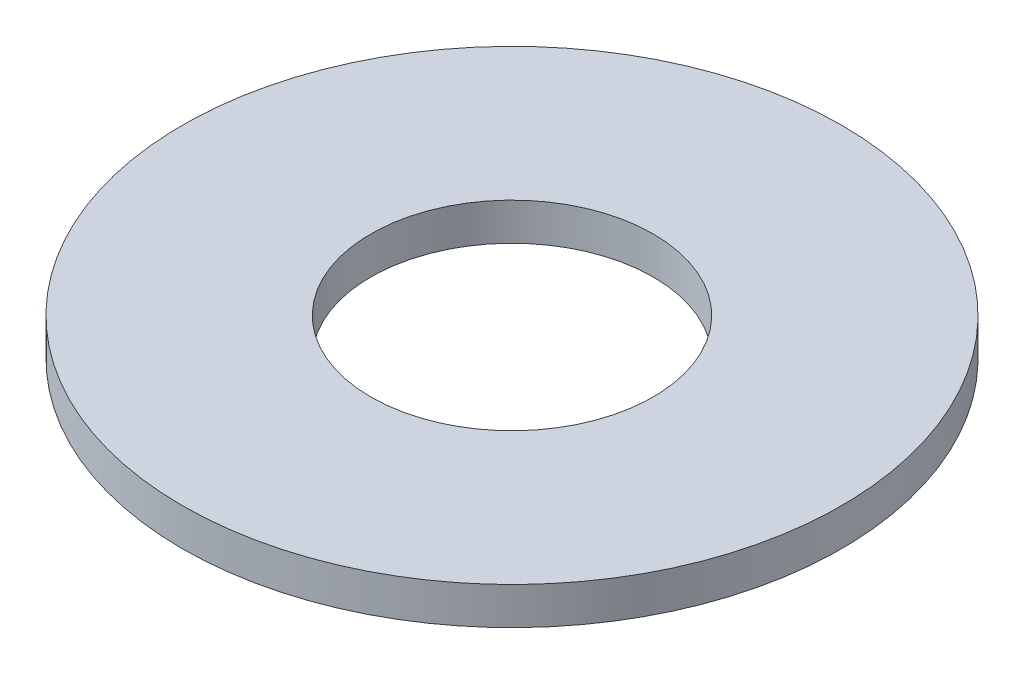
ISO-10303-21;
HEADER;
FILE_DESCRIPTION(('STEP AP214'),'2;1');
FILE_NAME('part.step','',(''),(''),'','','');
FILE_SCHEMA(('AUTOMOTIVE_DESIGN { 1 0 10303 214 1 1 1 1 }'));
ENDSEC;
DATA;
#1=APPLICATION_CONTEXT('core data for automotive mechanical design processes');
#2=APPLICATION_PROTOCOL_DEFINITION('international standard','automotive_design',2000,#1);
#3=PRODUCT_CONTEXT('',#1,'mechanical');
#4=PRODUCT('Part','Part','',(#3));
#5=PRODUCT_RELATED_PRODUCT_CATEGORY('part','',(#4));
#6=PRODUCT_DEFINITION_FORMATION('','',#4);
#7=PRODUCT_DEFINITION_CONTEXT('part definition',#1,'design');
#8=PRODUCT_DEFINITION('design','',#6,#7);
#9=PRODUCT_DEFINITION_SHAPE('','',#8);
#10=(LENGTH_UNIT() NAMED_UNIT(*) SI_UNIT(.MILLI.,.METRE.));
#11=(NAMED_UNIT(*) PLANE_ANGLE_UNIT() SI_UNIT($,.RADIAN.));
#12=(NAMED_UNIT(*) SI_UNIT($,.STERADIAN.) SOLID_ANGLE_UNIT());
#13=UNCERTAINTY_MEASURE_WITH_UNIT(LENGTH_MEASURE(1.E-05),#10,'distance_accuracy_value','');
#14=(GEOMETRIC_REPRESENTATION_CONTEXT(3) GLOBAL_UNCERTAINTY_ASSIGNED_CONTEXT((#13)) GLOBAL_UNIT_ASSIGNED_CONTEXT((#10,
#11,#12)) REPRESENTATION_CONTEXT('',''));
#15=CARTESIAN_POINT('',(0.,0.,0.));
#16=DIRECTION('',(0.,0.,1.));
#17=DIRECTION('',(1.,0.,0.));
#18=AXIS2_PLACEMENT_3D('',#15,#16,#17);
#19=CARTESIAN_POINT('',(0.,0.79375,0.));
#20=DIRECTION('',(0.,1.,0.));
#21=DIRECTION('',(0.,0.,1.));
#22=AXIS2_PLACEMENT_3D('',#19,#20,#21);
#23=PLANE('',#22);
#24=CARTESIAN_POINT('',(0.,0.79375,0.));
#25=DIRECTION('',(0.,1.,0.));
#26=DIRECTION('',(0.,0.,1.));
#27=AXIS2_PLACEMENT_3D('',#24,#25,#26);
#28=CIRCLE('',#27,7.);
#29=CARTESIAN_POINT('',(0.,0.79375,7.));
#30=VERTEX_POINT('',#29);
#31=EDGE_CURVE('E10',#30,#30,#28,.T.);
#32=ORIENTED_EDGE('',*,*,#31,.T.);
#33=EDGE_LOOP('',(#32));
#34=FACE_BOUND('',#33,.T.);
#35=CARTESIAN_POINT('',(0.,0.79375,0.));
#36=DIRECTION('',(0.,1.,0.));
#37=DIRECTION('',(0.,0.,1.));
#38=AXIS2_PLACEMENT_3D('',#35,#36,#37);
#39=CIRCLE('',#38,3.);
#40=CARTESIAN_POINT('',(0.,0.79375,3.));
#41=VERTEX_POINT('',#40);
#42=EDGE_CURVE('E46',#41,#41,#39,.T.);
#43=ORIENTED_EDGE('',*,*,#42,.F.);
#44=EDGE_LOOP('',(#43));
#45=FACE_BOUND('',#44,.T.);
#46=ADVANCED_FACE('F35',(#34,#45),#23,.T.);
#47=CARTESIAN_POINT('',(0.,0.,0.));
#48=DIRECTION('',(0.,1.,0.));
#49=DIRECTION('',(0.,0.,1.));
#50=AXIS2_PLACEMENT_3D('',#47,#48,#49);
#51=PLANE('',#50);
#52=CARTESIAN_POINT('',(0.,0.,0.));
#53=DIRECTION('',(0.,1.,0.));
#54=DIRECTION('',(0.,0.,1.));
#55=AXIS2_PLACEMENT_3D('',#52,#53,#54);
#56=CIRCLE('',#55,7.);
#57=CARTESIAN_POINT('',(0.,0.,7.));
#58=VERTEX_POINT('',#57);
#59=EDGE_CURVE('E39',#58,#58,#56,.T.);
#60=ORIENTED_EDGE('',*,*,#59,.F.);
#61=EDGE_LOOP('',(#60));
#62=FACE_BOUND('',#61,.T.);
#63=CARTESIAN_POINT('',(0.,0.,0.));
#64=DIRECTION('',(0.,1.,0.));
#65=DIRECTION('',(0.,0.,1.));
#66=AXIS2_PLACEMENT_3D('',#63,#64,#65);
#67=CIRCLE('',#66,3.);
#68=CARTESIAN_POINT('',(0.,0.,3.));
#69=VERTEX_POINT('',#68);
#70=EDGE_CURVE('E48',#69,#69,#67,.T.);
#71=ORIENTED_EDGE('',*,*,#70,.T.);
#72=EDGE_LOOP('',(#71));
#73=FACE_BOUND('',#72,.T.);
#74=ADVANCED_FACE('F58',(#62,#73),#51,.F.);
#75=CARTESIAN_POINT('',(0.,0.79375,0.));
#76=DIRECTION('',(0.,-1.,0.));
#77=DIRECTION('',(0.,0.,-1.));
#78=AXIS2_PLACEMENT_3D('',#75,#76,#77);
#79=CYLINDRICAL_SURFACE('',#78,7.);
#80=ORIENTED_EDGE('',*,*,#31,.F.);
#81=EDGE_LOOP('',(#80));
#82=FACE_BOUND('',#81,.T.);
#83=ORIENTED_EDGE('',*,*,#59,.T.);
#84=EDGE_LOOP('',(#83));
#85=FACE_BOUND('',#84,.T.);
#86=ADVANCED_FACE('F37',(#82,#85),#79,.T.);
#87=CARTESIAN_POINT('',(0.,0.79375,0.));
#88=DIRECTION('',(0.,-1.,0.));
#89=DIRECTION('',(0.,0.,-1.));
#90=AXIS2_PLACEMENT_3D('',#87,#88,#89);
#91=CYLINDRICAL_SURFACE('',#90,3.);
#92=ORIENTED_EDGE('',*,*,#42,.T.);
#93=EDGE_LOOP('',(#92));
#94=FACE_BOUND('',#93,.T.);
#95=ORIENTED_EDGE('',*,*,#70,.F.);
#96=EDGE_LOOP('',(#95));
#97=FACE_BOUND('',#96,.T.);
#98=ADVANCED_FACE('F54',(#94,#97),#91,.F.);
#99=CLOSED_SHELL('',(#46,#74,#86,#98));
#100=MANIFOLD_SOLID_BREP('B2',#99);
#101=ADVANCED_BREP_SHAPE_REPRESENTATION('',(#18,#100),#14);
#102=SHAPE_DEFINITION_REPRESENTATION(#9,#101);
ENDSEC;
END-ISO-10303-21;
